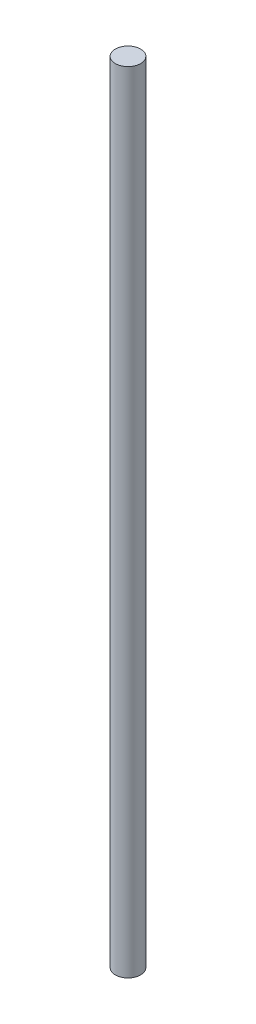
ISO-10303-21;
HEADER;
FILE_DESCRIPTION(('STEP AP214'),'2;1');
FILE_NAME('part.step','',(''),(''),'','','');
FILE_SCHEMA(('AUTOMOTIVE_DESIGN { 1 0 10303 214 1 1 1 1 }'));
ENDSEC;
DATA;
#1=APPLICATION_CONTEXT('core data for automotive mechanical design processes');
#2=APPLICATION_PROTOCOL_DEFINITION('international standard','automotive_design',2000,#1);
#3=PRODUCT_CONTEXT('',#1,'mechanical');
#4=PRODUCT('Part','Part','',(#3));
#5=PRODUCT_RELATED_PRODUCT_CATEGORY('part','',(#4));
#6=PRODUCT_DEFINITION_FORMATION('','',#4);
#7=PRODUCT_DEFINITION_CONTEXT('part definition',#1,'design');
#8=PRODUCT_DEFINITION('design','',#6,#7);
#9=PRODUCT_DEFINITION_SHAPE('','',#8);
#10=(LENGTH_UNIT() NAMED_UNIT(*) SI_UNIT(.MILLI.,.METRE.));
#11=(NAMED_UNIT(*) PLANE_ANGLE_UNIT() SI_UNIT($,.RADIAN.));
#12=(NAMED_UNIT(*) SI_UNIT($,.STERADIAN.) SOLID_ANGLE_UNIT());
#13=UNCERTAINTY_MEASURE_WITH_UNIT(LENGTH_MEASURE(1.E-05),#10,'distance_accuracy_value','');
#14=(GEOMETRIC_REPRESENTATION_CONTEXT(3) GLOBAL_UNCERTAINTY_ASSIGNED_CONTEXT((#13)) GLOBAL_UNIT_ASSIGNED_CONTEXT((#10,
#11,#12)) REPRESENTATION_CONTEXT('',''));
#15=CARTESIAN_POINT('',(0.,0.,0.));
#16=DIRECTION('',(0.,0.,1.));
#17=DIRECTION('',(1.,0.,0.));
#18=AXIS2_PLACEMENT_3D('',#15,#16,#17);
#19=CARTESIAN_POINT('',(0.,250.,0.));
#20=DIRECTION('',(0.,-1.,0.));
#21=DIRECTION('',(0.,0.,-1.));
#22=AXIS2_PLACEMENT_3D('',#19,#20,#21);
#23=CYLINDRICAL_SURFACE('',#22,4.);
#24=CARTESIAN_POINT('',(0.,250.,0.));
#25=DIRECTION('',(0.,1.,0.));
#26=DIRECTION('',(0.,0.,1.));
#27=AXIS2_PLACEMENT_3D('',#24,#25,#26);
#28=CIRCLE('',#27,4.);
#29=CARTESIAN_POINT('',(0.,250.,4.));
#30=VERTEX_POINT('',#29);
#31=EDGE_CURVE('E10',#30,#30,#28,.T.);
#32=ORIENTED_EDGE('',*,*,#31,.F.);
#33=EDGE_LOOP('',(#32));
#34=FACE_BOUND('',#33,.T.);
#35=CARTESIAN_POINT('',(0.,0.,0.));
#36=DIRECTION('',(0.,1.,0.));
#37=DIRECTION('',(0.,0.,1.));
#38=AXIS2_PLACEMENT_3D('',#35,#36,#37);
#39=CIRCLE('',#38,4.);
#40=CARTESIAN_POINT('',(0.,0.,4.));
#41=VERTEX_POINT('',#40);
#42=EDGE_CURVE('E35',#41,#41,#39,.T.);
#43=ORIENTED_EDGE('',*,*,#42,.T.);
#44=EDGE_LOOP('',(#43));
#45=FACE_BOUND('',#44,.T.);
#46=ADVANCED_FACE('F32',(#34,#45),#23,.T.);
#47=CARTESIAN_POINT('',(0.,250.,0.));
#48=DIRECTION('',(0.,1.,0.));
#49=DIRECTION('',(0.,0.,1.));
#50=AXIS2_PLACEMENT_3D('',#47,#48,#49);
#51=PLANE('',#50);
#52=ORIENTED_EDGE('',*,*,#31,.T.);
#53=EDGE_LOOP('',(#52));
#54=FACE_BOUND('',#53,.T.);
#55=ADVANCED_FACE('F47',(#54),#51,.T.);
#56=CARTESIAN_POINT('',(0.,0.,0.));
#57=DIRECTION('',(0.,1.,0.));
#58=DIRECTION('',(0.,0.,1.));
#59=AXIS2_PLACEMENT_3D('',#56,#57,#58);
#60=PLANE('',#59);
#61=ORIENTED_EDGE('',*,*,#42,.F.);
#62=EDGE_LOOP('',(#61));
#63=FACE_BOUND('',#62,.T.);
#64=ADVANCED_FACE('F45',(#63),#60,.F.);
#65=CLOSED_SHELL('',(#46,#55,#64));
#66=MANIFOLD_SOLID_BREP('B2',#65);
#67=ADVANCED_BREP_SHAPE_REPRESENTATION('',(#18,#66),#14);
#68=SHAPE_DEFINITION_REPRESENTATION(#9,#67);
ENDSEC;
END-ISO-10303-21;
